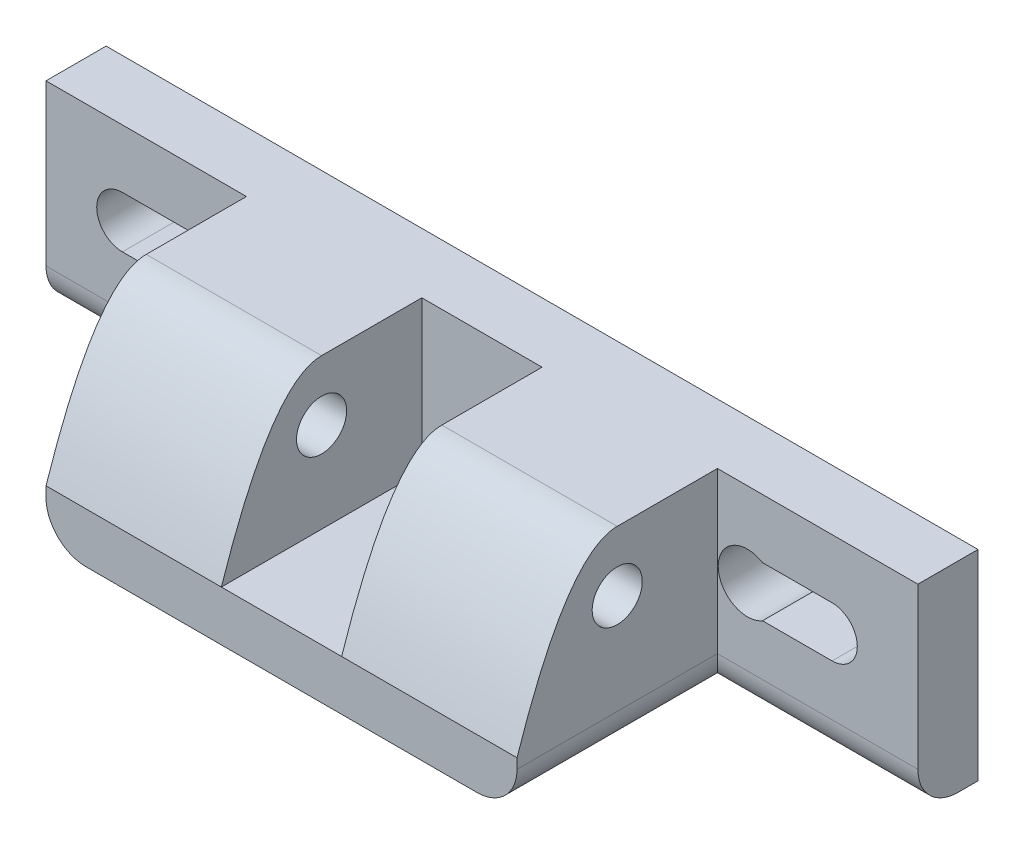
ISO-10303-21;
HEADER;
FILE_DESCRIPTION(('STEP AP214'),'2;1');
FILE_NAME('part.step','',(''),(''),'','','');
FILE_SCHEMA(('AUTOMOTIVE_DESIGN { 1 0 10303 214 1 1 1 1 }'));
ENDSEC;
DATA;
#1=APPLICATION_CONTEXT('core data for automotive mechanical design processes');
#2=APPLICATION_PROTOCOL_DEFINITION('international standard','automotive_design',2000,#1);
#3=PRODUCT_CONTEXT('',#1,'mechanical');
#4=PRODUCT('Part','Part','',(#3));
#5=PRODUCT_RELATED_PRODUCT_CATEGORY('part','',(#4));
#6=PRODUCT_DEFINITION_FORMATION('','',#4);
#7=PRODUCT_DEFINITION_CONTEXT('part definition',#1,'design');
#8=PRODUCT_DEFINITION('design','',#6,#7);
#9=PRODUCT_DEFINITION_SHAPE('','',#8);
#10=(LENGTH_UNIT() NAMED_UNIT(*) SI_UNIT(.MILLI.,.METRE.));
#11=(NAMED_UNIT(*) PLANE_ANGLE_UNIT() SI_UNIT($,.RADIAN.));
#12=(NAMED_UNIT(*) SI_UNIT($,.STERADIAN.) SOLID_ANGLE_UNIT());
#13=UNCERTAINTY_MEASURE_WITH_UNIT(LENGTH_MEASURE(1.E-05),#10,'distance_accuracy_value','');
#14=(GEOMETRIC_REPRESENTATION_CONTEXT(3) GLOBAL_UNCERTAINTY_ASSIGNED_CONTEXT((#13)) GLOBAL_UNIT_ASSIGNED_CONTEXT((#10,
#11,#12)) REPRESENTATION_CONTEXT('',''));
#15=CARTESIAN_POINT('',(0.,0.,0.));
#16=DIRECTION('',(0.,0.,1.));
#17=DIRECTION('',(1.,0.,0.));
#18=AXIS2_PLACEMENT_3D('',#15,#16,#17);
#19=CARTESIAN_POINT('',(0.,25.4,0.));
#20=DIRECTION('',(0.,1.,0.));
#21=DIRECTION('',(0.,0.,1.));
#22=AXIS2_PLACEMENT_3D('',#19,#20,#21);
#23=PLANE('',#22);
#24=DIRECTION('',(0.,0.,1.));
#25=VECTOR('',#24,1.);
#26=CARTESIAN_POINT('',(-29.845,25.4,12.7));
#27=LINE('',#26,#25);
#28=CARTESIAN_POINT('',(-29.845,25.4,-12.7));
#29=VERTEX_POINT('',#28);
#30=CARTESIAN_POINT('',(-29.845,25.4,0.));
#31=VERTEX_POINT('',#30);
#32=EDGE_CURVE('E399',#29,#31,#27,.T.);
#33=ORIENTED_EDGE('',*,*,#32,.T.);
#34=DIRECTION('',(1.,0.,0.));
#35=VECTOR('',#34,1.);
#36=CARTESIAN_POINT('',(-55.245025,25.4,0.));
#37=LINE('',#36,#35);
#38=CARTESIAN_POINT('',(-7.62,25.4,0.));
#39=VERTEX_POINT('',#38);
#40=EDGE_CURVE('E762',#31,#39,#37,.T.);
#41=ORIENTED_EDGE('',*,*,#40,.T.);
#42=DIRECTION('',(0.,0.,1.));
#43=VECTOR('',#42,1.);
#44=CARTESIAN_POINT('',(-7.62,25.4,12.7));
#45=LINE('',#44,#43);
#46=CARTESIAN_POINT('',(-7.61999999999999,25.4,-12.7));
#47=VERTEX_POINT('',#46);
#48=EDGE_CURVE('E417',#47,#39,#45,.T.);
#49=ORIENTED_EDGE('',*,*,#48,.F.);
#50=DIRECTION('',(1.,0.,0.));
#51=VECTOR('',#50,1.);
#52=CARTESIAN_POINT('',(55.245,25.4,-12.7));
#53=LINE('',#52,#51);
#54=CARTESIAN_POINT('',(7.62,25.4,-12.7));
#55=VERTEX_POINT('',#54);
#56=EDGE_CURVE('E451',#47,#55,#53,.T.);
#57=ORIENTED_EDGE('',*,*,#56,.T.);
#58=DIRECTION('',(0.,0.,-1.));
#59=VECTOR('',#58,1.);
#60=CARTESIAN_POINT('',(7.62,25.4,12.7));
#61=LINE('',#60,#59);
#62=CARTESIAN_POINT('',(7.62,25.4,0.));
#63=VERTEX_POINT('',#62);
#64=EDGE_CURVE('E420',#63,#55,#61,.T.);
#65=ORIENTED_EDGE('',*,*,#64,.F.);
#66=CARTESIAN_POINT('',(29.845,25.4,0.));
#67=VERTEX_POINT('',#66);
#68=EDGE_CURVE('E763',#63,#67,#37,.T.);
#69=ORIENTED_EDGE('',*,*,#68,.T.);
#70=DIRECTION('',(0.,0.,-1.));
#71=VECTOR('',#70,1.);
#72=CARTESIAN_POINT('',(29.845,25.4,12.7));
#73=LINE('',#72,#71);
#74=CARTESIAN_POINT('',(29.845,25.4,-12.7));
#75=VERTEX_POINT('',#74);
#76=EDGE_CURVE('E410',#67,#75,#73,.T.);
#77=ORIENTED_EDGE('',*,*,#76,.T.);
#78=CARTESIAN_POINT('',(55.245,25.4,-12.7));
#79=VERTEX_POINT('',#78);
#80=EDGE_CURVE('E448',#75,#79,#53,.T.);
#81=ORIENTED_EDGE('',*,*,#80,.T.);
#82=DIRECTION('',(0.,0.,1.));
#83=VECTOR('',#82,1.);
#84=CARTESIAN_POINT('',(55.245,25.4,-20.32));
#85=LINE('',#84,#83);
#86=CARTESIAN_POINT('',(55.245,25.4,-20.32));
#87=VERTEX_POINT('',#86);
#88=EDGE_CURVE('E458',#87,#79,#85,.T.);
#89=ORIENTED_EDGE('',*,*,#88,.F.);
#90=DIRECTION('',(1.,0.,0.));
#91=VECTOR('',#90,1.);
#92=CARTESIAN_POINT('',(55.245,25.4,-20.32));
#93=LINE('',#92,#91);
#94=CARTESIAN_POINT('',(-55.245,25.4,-20.32));
#95=VERTEX_POINT('',#94);
#96=EDGE_CURVE('E476',#95,#87,#93,.T.);
#97=ORIENTED_EDGE('',*,*,#96,.F.);
#98=DIRECTION('',(0.,0.,1.));
#99=VECTOR('',#98,1.);
#100=CARTESIAN_POINT('',(-55.245,25.4,-20.32));
#101=LINE('',#100,#99);
#102=CARTESIAN_POINT('',(-55.245,25.4,-12.7));
#103=VERTEX_POINT('',#102);
#104=EDGE_CURVE('E470',#95,#103,#101,.T.);
#105=ORIENTED_EDGE('',*,*,#104,.T.);
#106=EDGE_CURVE('E462',#103,#29,#53,.T.);
#107=ORIENTED_EDGE('',*,*,#106,.T.);
#108=EDGE_LOOP('',(#33,#41,#49,#57,#65,#69,#77,#81,#89,#97,#105,#107));
#109=FACE_BOUND('',#108,.T.);
#110=ADVANCED_FACE('F35',(#109),#23,.T.);
#111=CARTESIAN_POINT('',(-29.845,25.4,12.7));
#112=DIRECTION('',(1.,0.,0.));
#113=DIRECTION('',(0.,0.,-1.));
#114=AXIS2_PLACEMENT_3D('',#111,#112,#113);
#115=PLANE('',#114);
#116=CARTESIAN_POINT('',(-29.845,17.78,0.));
#117=DIRECTION('',(-1.,0.,0.));
#118=DIRECTION('',(0.,0.,1.));
#119=AXIS2_PLACEMENT_3D('',#116,#117,#118);
#120=CIRCLE('',#119,3.175);
#121=CARTESIAN_POINT('',(-29.845,17.78,3.175));
#122=VERTEX_POINT('',#121);
#123=EDGE_CURVE('E441',#122,#122,#120,.T.);
#124=ORIENTED_EDGE('',*,*,#123,.F.);
#125=EDGE_LOOP('',(#124));
#126=FACE_BOUND('',#125,.T.);
#127=DIRECTION('',(0.,-1.,0.));
#128=VECTOR('',#127,1.);
#129=CARTESIAN_POINT('',(-29.845,25.4,-12.7));
#130=LINE('',#129,#128);
#131=CARTESIAN_POINT('',(-29.845,5.08,-12.7));
#132=VERTEX_POINT('',#131);
#133=EDGE_CURVE('E405',#29,#132,#130,.T.);
#134=ORIENTED_EDGE('',*,*,#133,.T.);
#135=DIRECTION('',(0.,0.,1.));
#136=VECTOR('',#135,1.);
#137=CARTESIAN_POINT('',(-29.845,5.08,12.7));
#138=LINE('',#137,#136);
#139=CARTESIAN_POINT('',(-29.845,5.08,12.7));
#140=VERTEX_POINT('',#139);
#141=EDGE_CURVE('E367',#132,#140,#138,.T.);
#142=ORIENTED_EDGE('',*,*,#141,.T.);
#143=DIRECTION('',(0.,-1.,0.));
#144=VECTOR('',#143,1.);
#145=CARTESIAN_POINT('',(-29.845,25.4,12.7));
#146=LINE('',#145,#144);
#147=CARTESIAN_POINT('',(-29.845,6.35,12.7));
#148=VERTEX_POINT('',#147);
#149=EDGE_CURVE('E538',#148,#140,#146,.T.);
#150=ORIENTED_EDGE('',*,*,#149,.F.);
#151=CARTESIAN_POINT('',(-29.845,6.35,12.7));
#152=CARTESIAN_POINT('',(-29.845,25.4,6.35));
#153=CARTESIAN_POINT('',(-29.845,25.4,0.));
#154=B_SPLINE_CURVE_WITH_KNOTS('',2,(#151,#152,#153),.UNSPECIFIED.,.F.,.F.,(3,3),(0.,0.5),.UNSPECIFIED.);
#155=EDGE_CURVE('E489',#148,#31,#154,.T.);
#156=ORIENTED_EDGE('',*,*,#155,.T.);
#157=ORIENTED_EDGE('',*,*,#32,.F.);
#158=EDGE_LOOP('',(#134,#142,#150,#156,#157));
#159=FACE_BOUND('',#158,.T.);
#160=ADVANCED_FACE('F323',(#126,#159),#115,.F.);
#161=CARTESIAN_POINT('',(29.845,25.4,12.7));
#162=DIRECTION('',(0.,0.,-1.));
#163=DIRECTION('',(-1.,0.,0.));
#164=AXIS2_PLACEMENT_3D('',#161,#162,#163);
#165=PLANE('',#164);
#166=ORIENTED_EDGE('',*,*,#149,.T.);
#167=CARTESIAN_POINT('',(-24.765,5.08,12.7));
#168=DIRECTION('',(0.,0.,-1.));
#169=DIRECTION('',(-1.,0.,0.));
#170=AXIS2_PLACEMENT_3D('',#167,#168,#169);
#171=CIRCLE('',#170,5.08);
#172=CARTESIAN_POINT('',(-24.765,0.,12.7));
#173=VERTEX_POINT('',#172);
#174=EDGE_CURVE('E366',#140,#173,#171,.F.);
#175=ORIENTED_EDGE('',*,*,#174,.T.);
#176=DIRECTION('',(1.,0.,0.));
#177=VECTOR('',#176,1.);
#178=CARTESIAN_POINT('',(29.845,0.,12.7));
#179=LINE('',#178,#177);
#180=CARTESIAN_POINT('',(24.765,0.,12.7));
#181=VERTEX_POINT('',#180);
#182=EDGE_CURVE('E390',#173,#181,#179,.T.);
#183=ORIENTED_EDGE('',*,*,#182,.T.);
#184=CARTESIAN_POINT('',(24.765,5.08,12.7));
#185=DIRECTION('',(0.,0.,-1.));
#186=DIRECTION('',(-1.,0.,0.));
#187=AXIS2_PLACEMENT_3D('',#184,#185,#186);
#188=CIRCLE('',#187,5.08);
#189=CARTESIAN_POINT('',(29.845,5.08,12.7));
#190=VERTEX_POINT('',#189);
#191=EDGE_CURVE('E358',#181,#190,#188,.F.);
#192=ORIENTED_EDGE('',*,*,#191,.T.);
#193=DIRECTION('',(0.,-1.,0.));
#194=VECTOR('',#193,1.);
#195=CARTESIAN_POINT('',(29.845,25.4,12.7));
#196=LINE('',#195,#194);
#197=CARTESIAN_POINT('',(29.845,6.35,12.7));
#198=VERTEX_POINT('',#197);
#199=EDGE_CURVE('E542',#198,#190,#196,.T.);
#200=ORIENTED_EDGE('',*,*,#199,.F.);
#201=DIRECTION('',(1.,0.,0.));
#202=VECTOR('',#201,1.);
#203=CARTESIAN_POINT('',(-55.245025,6.35,12.7));
#204=LINE('',#203,#202);
#205=CARTESIAN_POINT('',(7.62,6.35,12.7));
#206=VERTEX_POINT('',#205);
#207=EDGE_CURVE('E760',#206,#198,#204,.T.);
#208=ORIENTED_EDGE('',*,*,#207,.F.);
#209=DIRECTION('',(1.,0.,0.));
#210=VECTOR('',#209,1.);
#211=CARTESIAN_POINT('',(7.62,6.35,12.7));
#212=LINE('',#211,#210);
#213=CARTESIAN_POINT('',(-7.62,6.35,12.7));
#214=VERTEX_POINT('',#213);
#215=EDGE_CURVE('E431',#214,#206,#212,.T.);
#216=ORIENTED_EDGE('',*,*,#215,.F.);
#217=EDGE_CURVE('E540',#148,#214,#204,.T.);
#218=ORIENTED_EDGE('',*,*,#217,.F.);
#219=EDGE_LOOP('',(#166,#175,#183,#192,#200,#208,#216,#218));
#220=FACE_BOUND('',#219,.T.);
#221=ADVANCED_FACE('F331',(#220),#165,.F.);
#222=CARTESIAN_POINT('',(29.845,25.4,12.7));
#223=DIRECTION('',(-1.,0.,0.));
#224=DIRECTION('',(0.,0.,1.));
#225=AXIS2_PLACEMENT_3D('',#222,#223,#224);
#226=PLANE('',#225);
#227=CARTESIAN_POINT('',(29.845,17.78,0.));
#228=DIRECTION('',(-1.,0.,0.));
#229=DIRECTION('',(0.,0.,1.));
#230=AXIS2_PLACEMENT_3D('',#227,#228,#229);
#231=CIRCLE('',#230,3.175);
#232=CARTESIAN_POINT('',(29.845,17.78,3.175));
#233=VERTEX_POINT('',#232);
#234=EDGE_CURVE('E444',#233,#233,#231,.T.);
#235=ORIENTED_EDGE('',*,*,#234,.T.);
#236=EDGE_LOOP('',(#235));
#237=FACE_BOUND('',#236,.T.);
#238=ORIENTED_EDGE('',*,*,#199,.T.);
#239=DIRECTION('',(0.,0.,-1.));
#240=VECTOR('',#239,1.);
#241=CARTESIAN_POINT('',(29.845,5.08,12.7));
#242=LINE('',#241,#240);
#243=CARTESIAN_POINT('',(29.845,5.08,-12.7));
#244=VERTEX_POINT('',#243);
#245=EDGE_CURVE('E362',#190,#244,#242,.T.);
#246=ORIENTED_EDGE('',*,*,#245,.T.);
#247=DIRECTION('',(0.,-1.,0.));
#248=VECTOR('',#247,1.);
#249=CARTESIAN_POINT('',(29.845,25.4,-12.7));
#250=LINE('',#249,#248);
#251=EDGE_CURVE('E409',#75,#244,#250,.T.);
#252=ORIENTED_EDGE('',*,*,#251,.F.);
#253=ORIENTED_EDGE('',*,*,#76,.F.);
#254=CARTESIAN_POINT('',(29.845,6.35,12.7));
#255=CARTESIAN_POINT('',(29.845,25.4,6.35));
#256=CARTESIAN_POINT('',(29.845,25.4,0.));
#257=B_SPLINE_CURVE_WITH_KNOTS('',2,(#254,#255,#256),.UNSPECIFIED.,.F.,.F.,(3,3),(0.,0.5),.UNSPECIFIED.);
#258=EDGE_CURVE('E267',#198,#67,#257,.T.);
#259=ORIENTED_EDGE('',*,*,#258,.F.);
#260=EDGE_LOOP('',(#238,#246,#252,#253,#259));
#261=FACE_BOUND('',#260,.T.);
#262=ADVANCED_FACE('F327',(#237,#261),#226,.F.);
#263=CARTESIAN_POINT('',(0.,0.,0.));
#264=DIRECTION('',(0.,1.,0.));
#265=DIRECTION('',(0.,0.,1.));
#266=AXIS2_PLACEMENT_3D('',#263,#264,#265);
#267=PLANE('',#266);
#268=DIRECTION('',(0.,0.,1.));
#269=VECTOR('',#268,1.);
#270=CARTESIAN_POINT('',(-24.765,0.,0.));
#271=LINE('',#270,#269);
#272=CARTESIAN_POINT('',(-24.765,0.,-17.78));
#273=VERTEX_POINT('',#272);
#274=EDGE_CURVE('E520',#173,#273,#271,.F.);
#275=ORIENTED_EDGE('',*,*,#274,.T.);
#276=DIRECTION('',(-1.,0.,0.));
#277=VECTOR('',#276,1.);
#278=CARTESIAN_POINT('',(0.,0.,-17.78));
#279=LINE('',#278,#277);
#280=CARTESIAN_POINT('',(-55.245,0.,-17.78));
#281=VERTEX_POINT('',#280);
#282=EDGE_CURVE('E514',#273,#281,#279,.T.);
#283=ORIENTED_EDGE('',*,*,#282,.T.);
#284=DIRECTION('',(0.,0.,1.));
#285=VECTOR('',#284,1.);
#286=CARTESIAN_POINT('',(-55.245,0.,-20.32));
#287=LINE('',#286,#285);
#288=CARTESIAN_POINT('',(-55.245,0.,-20.32));
#289=VERTEX_POINT('',#288);
#290=EDGE_CURVE('E468',#289,#281,#287,.T.);
#291=ORIENTED_EDGE('',*,*,#290,.F.);
#292=DIRECTION('',(-1.,0.,0.));
#293=VECTOR('',#292,1.);
#294=CARTESIAN_POINT('',(55.245,0.,-20.32));
#295=LINE('',#294,#293);
#296=CARTESIAN_POINT('',(55.245,0.,-20.32));
#297=VERTEX_POINT('',#296);
#298=EDGE_CURVE('E485',#297,#289,#295,.T.);
#299=ORIENTED_EDGE('',*,*,#298,.F.);
#300=DIRECTION('',(0.,0.,1.));
#301=VECTOR('',#300,1.);
#302=CARTESIAN_POINT('',(55.245,0.,-20.32));
#303=LINE('',#302,#301);
#304=CARTESIAN_POINT('',(55.245,0.,-17.78));
#305=VERTEX_POINT('',#304);
#306=EDGE_CURVE('E445',#297,#305,#303,.T.);
#307=ORIENTED_EDGE('',*,*,#306,.T.);
#308=DIRECTION('',(-1.,0.,0.));
#309=VECTOR('',#308,1.);
#310=CARTESIAN_POINT('',(0.,0.,-17.78));
#311=LINE('',#310,#309);
#312=CARTESIAN_POINT('',(24.765,0.,-17.78));
#313=VERTEX_POINT('',#312);
#314=EDGE_CURVE('E518',#305,#313,#311,.T.);
#315=ORIENTED_EDGE('',*,*,#314,.T.);
#316=DIRECTION('',(0.,0.,-1.));
#317=VECTOR('',#316,1.);
#318=CARTESIAN_POINT('',(24.765,0.,0.));
#319=LINE('',#318,#317);
#320=EDGE_CURVE('E360',#313,#181,#319,.F.);
#321=ORIENTED_EDGE('',*,*,#320,.T.);
#322=ORIENTED_EDGE('',*,*,#182,.F.);
#323=EDGE_LOOP('',(#275,#283,#291,#299,#307,#315,#321,#322));
#324=FACE_BOUND('',#323,.T.);
#325=ADVANCED_FACE('F319',(#324),#267,.F.);
#326=CARTESIAN_POINT('',(-7.62,6.35,12.7));
#327=DIRECTION('',(-1.,0.,0.));
#328=DIRECTION('',(0.,0.,1.));
#329=AXIS2_PLACEMENT_3D('',#326,#327,#328);
#330=PLANE('',#329);
#331=CARTESIAN_POINT('',(-7.62,17.78,0.));
#332=DIRECTION('',(-1.,0.,0.));
#333=DIRECTION('',(0.,0.,1.));
#334=AXIS2_PLACEMENT_3D('',#331,#332,#333);
#335=CIRCLE('',#334,3.175);
#336=CARTESIAN_POINT('',(-7.61999999999999,17.78,3.175));
#337=VERTEX_POINT('',#336);
#338=EDGE_CURVE('E421',#337,#337,#335,.T.);
#339=ORIENTED_EDGE('',*,*,#338,.T.);
#340=EDGE_LOOP('',(#339));
#341=FACE_BOUND('',#340,.T.);
#342=DIRECTION('',(0.,0.,1.));
#343=VECTOR('',#342,1.);
#344=CARTESIAN_POINT('',(-7.62,6.35,12.7));
#345=LINE('',#344,#343);
#346=CARTESIAN_POINT('',(-7.62,6.35,-10.16));
#347=VERTEX_POINT('',#346);
#348=EDGE_CURVE('E435',#347,#214,#345,.T.);
#349=ORIENTED_EDGE('',*,*,#348,.F.);
#350=CARTESIAN_POINT('',(-7.62,8.89,-10.16));
#351=DIRECTION('',(-1.,0.,0.));
#352=DIRECTION('',(0.,0.,1.));
#353=AXIS2_PLACEMENT_3D('',#350,#351,#352);
#354=CIRCLE('',#353,2.54);
#355=CARTESIAN_POINT('',(-7.62,8.89,-12.7));
#356=VERTEX_POINT('',#355);
#357=EDGE_CURVE('E57',#347,#356,#354,.F.);
#358=ORIENTED_EDGE('',*,*,#357,.T.);
#359=DIRECTION('',(0.,1.,0.));
#360=VECTOR('',#359,1.);
#361=CARTESIAN_POINT('',(-7.62,6.35,-12.7));
#362=LINE('',#361,#360);
#363=EDGE_CURVE('E387',#356,#47,#362,.T.);
#364=ORIENTED_EDGE('',*,*,#363,.T.);
#365=ORIENTED_EDGE('',*,*,#48,.T.);
#366=CARTESIAN_POINT('',(-7.62,6.35,12.7));
#367=CARTESIAN_POINT('',(-7.62,25.4,6.35));
#368=CARTESIAN_POINT('',(-7.62,25.4,0.));
#369=B_SPLINE_CURVE_WITH_KNOTS('',2,(#366,#367,#368),.UNSPECIFIED.,.F.,.F.,(3,3),(0.,0.5),.UNSPECIFIED.);
#370=EDGE_CURVE('E492',#39,#214,#369,.F.);
#371=ORIENTED_EDGE('',*,*,#370,.T.);
#372=EDGE_LOOP('',(#349,#358,#364,#365,#371));
#373=FACE_BOUND('',#372,.T.);
#374=ADVANCED_FACE('F315',(#341,#373),#330,.F.);
#375=CARTESIAN_POINT('',(7.62,6.35,12.7));
#376=DIRECTION('',(1.,0.,0.));
#377=DIRECTION('',(0.,0.,-1.));
#378=AXIS2_PLACEMENT_3D('',#375,#376,#377);
#379=PLANE('',#378);
#380=CARTESIAN_POINT('',(7.62,17.78,0.));
#381=DIRECTION('',(1.,0.,0.));
#382=DIRECTION('',(0.,0.,-1.));
#383=AXIS2_PLACEMENT_3D('',#380,#381,#382);
#384=CIRCLE('',#383,3.175);
#385=CARTESIAN_POINT('',(7.62,17.78,3.175));
#386=VERTEX_POINT('',#385);
#387=EDGE_CURVE('E411',#386,#386,#384,.T.);
#388=ORIENTED_EDGE('',*,*,#387,.T.);
#389=EDGE_LOOP('',(#388));
#390=FACE_BOUND('',#389,.T.);
#391=DIRECTION('',(0.,1.,0.));
#392=VECTOR('',#391,1.);
#393=CARTESIAN_POINT('',(7.62,6.35,-12.7));
#394=LINE('',#393,#392);
#395=CARTESIAN_POINT('',(7.62,8.89,-12.7));
#396=VERTEX_POINT('',#395);
#397=EDGE_CURVE('E391',#396,#55,#394,.T.);
#398=ORIENTED_EDGE('',*,*,#397,.F.);
#399=CARTESIAN_POINT('',(7.62,8.89,-10.16));
#400=DIRECTION('',(1.,0.,0.));
#401=DIRECTION('',(0.,0.,-1.));
#402=AXIS2_PLACEMENT_3D('',#399,#400,#401);
#403=CIRCLE('',#402,2.54);
#404=CARTESIAN_POINT('',(7.62,6.35,-10.16));
#405=VERTEX_POINT('',#404);
#406=EDGE_CURVE('E11',#396,#405,#403,.F.);
#407=ORIENTED_EDGE('',*,*,#406,.T.);
#408=DIRECTION('',(0.,0.,-1.));
#409=VECTOR('',#408,1.);
#410=CARTESIAN_POINT('',(7.62,6.35,12.7));
#411=LINE('',#410,#409);
#412=EDGE_CURVE('E396',#206,#405,#411,.T.);
#413=ORIENTED_EDGE('',*,*,#412,.F.);
#414=CARTESIAN_POINT('',(7.62,6.35,12.7));
#415=CARTESIAN_POINT('',(7.62,25.4,6.35));
#416=CARTESIAN_POINT('',(7.62,25.4,0.));
#417=B_SPLINE_CURVE_WITH_KNOTS('',2,(#414,#415,#416),.UNSPECIFIED.,.F.,.F.,(3,3),(0.,0.5),.UNSPECIFIED.);
#418=EDGE_CURVE('E498',#206,#63,#417,.T.);
#419=ORIENTED_EDGE('',*,*,#418,.T.);
#420=ORIENTED_EDGE('',*,*,#64,.T.);
#421=EDGE_LOOP('',(#398,#407,#413,#419,#420));
#422=FACE_BOUND('',#421,.T.);
#423=ADVANCED_FACE('F311',(#390,#422),#379,.F.);
#424=CARTESIAN_POINT('',(0.,6.35,0.));
#425=DIRECTION('',(0.,1.,0.));
#426=DIRECTION('',(0.,0.,1.));
#427=AXIS2_PLACEMENT_3D('',#424,#425,#426);
#428=PLANE('',#427);
#429=ORIENTED_EDGE('',*,*,#412,.T.);
#430=DIRECTION('',(-1.,0.,0.));
#431=VECTOR('',#430,1.);
#432=CARTESIAN_POINT('',(0.,6.35,-10.16));
#433=LINE('',#432,#431);
#434=EDGE_CURVE('E379',#405,#347,#433,.T.);
#435=ORIENTED_EDGE('',*,*,#434,.T.);
#436=ORIENTED_EDGE('',*,*,#348,.T.);
#437=ORIENTED_EDGE('',*,*,#215,.T.);
#438=EDGE_LOOP('',(#429,#435,#436,#437));
#439=FACE_BOUND('',#438,.T.);
#440=ADVANCED_FACE('F308',(#439),#428,.T.);
#441=CARTESIAN_POINT('',(29.845,17.78,0.));
#442=DIRECTION('',(-1.,0.,0.));
#443=DIRECTION('',(0.,0.,1.));
#444=AXIS2_PLACEMENT_3D('',#441,#442,#443);
#445=CYLINDRICAL_SURFACE('',#444,3.175);
#446=CARTESIAN_POINT('',(29.845,17.78,3.175));
#447=CARTESIAN_POINT('',(29.6134895833333,17.78,3.175));
#448=CARTESIAN_POINT('',(29.3819791666667,17.78,3.175));
#449=CARTESIAN_POINT('',(28.9189583333333,17.78,3.175));
#450=CARTESIAN_POINT('',(28.6874479166667,17.78,3.175));
#451=CARTESIAN_POINT('',(28.2244270833333,17.78,3.175));
#452=CARTESIAN_POINT('',(27.9929166666667,17.78,3.175));
#453=CARTESIAN_POINT('',(27.5298958333333,17.78,3.175));
#454=CARTESIAN_POINT('',(27.2983854166667,17.78,3.175));
#455=CARTESIAN_POINT('',(26.8353645833333,17.78,3.175));
#456=CARTESIAN_POINT('',(26.6038541666667,17.78,3.175));
#457=CARTESIAN_POINT('',(26.1408333333333,17.78,3.175));
#458=CARTESIAN_POINT('',(25.9093229166667,17.78,3.175));
#459=CARTESIAN_POINT('',(25.4463020833333,17.78,3.175));
#460=CARTESIAN_POINT('',(25.2147916666667,17.78,3.175));
#461=CARTESIAN_POINT('',(24.7517708333333,17.78,3.175));
#462=CARTESIAN_POINT('',(24.5202604166667,17.78,3.175));
#463=CARTESIAN_POINT('',(24.0572395833333,17.78,3.175));
#464=CARTESIAN_POINT('',(23.8257291666667,17.78,3.175));
#465=CARTESIAN_POINT('',(23.3627083333333,17.78,3.175));
#466=CARTESIAN_POINT('',(23.1311979166667,17.78,3.175));
#467=CARTESIAN_POINT('',(22.6681770833333,17.78,3.175));
#468=CARTESIAN_POINT('',(22.4366666666667,17.78,3.175));
#469=CARTESIAN_POINT('',(21.9736458333333,17.78,3.175));
#470=CARTESIAN_POINT('',(21.7421354166667,17.78,3.175));
#471=CARTESIAN_POINT('',(21.2791145833333,17.78,3.175));
#472=CARTESIAN_POINT('',(21.0476041666667,17.78,3.175));
#473=CARTESIAN_POINT('',(20.5845833333333,17.78,3.175));
#474=CARTESIAN_POINT('',(20.3530729166667,17.78,3.175));
#475=CARTESIAN_POINT('',(19.8900520833333,17.78,3.175));
#476=CARTESIAN_POINT('',(19.6585416666667,17.78,3.175));
#477=CARTESIAN_POINT('',(19.1955208333333,17.78,3.175));
#478=CARTESIAN_POINT('',(18.9640104166667,17.78,3.175));
#479=CARTESIAN_POINT('',(18.5009895833333,17.78,3.175));
#480=CARTESIAN_POINT('',(18.2694791666667,17.78,3.175));
#481=CARTESIAN_POINT('',(17.8064583333333,17.78,3.175));
#482=CARTESIAN_POINT('',(17.5749479166667,17.78,3.175));
#483=CARTESIAN_POINT('',(17.1119270833333,17.78,3.175));
#484=CARTESIAN_POINT('',(16.8804166666667,17.78,3.175));
#485=CARTESIAN_POINT('',(16.4173958333333,17.78,3.175));
#486=CARTESIAN_POINT('',(16.1858854166667,17.78,3.175));
#487=CARTESIAN_POINT('',(15.7228645833333,17.78,3.175));
#488=CARTESIAN_POINT('',(15.4913541666667,17.78,3.175));
#489=CARTESIAN_POINT('',(15.0283333333333,17.78,3.175));
#490=CARTESIAN_POINT('',(14.7968229166667,17.78,3.175));
#491=CARTESIAN_POINT('',(14.3338020833333,17.78,3.175));
#492=CARTESIAN_POINT('',(14.1022916666667,17.78,3.175));
#493=CARTESIAN_POINT('',(13.6392708333333,17.78,3.175));
#494=CARTESIAN_POINT('',(13.4077604166667,17.78,3.175));
#495=CARTESIAN_POINT('',(12.9447395833333,17.78,3.175));
#496=CARTESIAN_POINT('',(12.7132291666667,17.78,3.175));
#497=CARTESIAN_POINT('',(12.2502083333333,17.78,3.175));
#498=CARTESIAN_POINT('',(12.0186979166667,17.78,3.175));
#499=CARTESIAN_POINT('',(11.5556770833333,17.78,3.175));
#500=CARTESIAN_POINT('',(11.3241666666667,17.78,3.175));
#501=CARTESIAN_POINT('',(10.8611458333333,17.78,3.175));
#502=CARTESIAN_POINT('',(10.6296354166667,17.78,3.175));
#503=CARTESIAN_POINT('',(10.1666145833333,17.78,3.175));
#504=CARTESIAN_POINT('',(9.93510416666667,17.78,3.175));
#505=CARTESIAN_POINT('',(9.47208333333333,17.78,3.175));
#506=CARTESIAN_POINT('',(9.24057291666666,17.78,3.175));
#507=CARTESIAN_POINT('',(8.77755208333333,17.78,3.175));
#508=CARTESIAN_POINT('',(8.54604166666667,17.78,3.175));
#509=CARTESIAN_POINT('',(8.08302083333333,17.78,3.175));
#510=CARTESIAN_POINT('',(7.85151041666667,17.78,3.175));
#511=CARTESIAN_POINT('',(7.62,17.78,3.175));
#512=B_SPLINE_CURVE_WITH_KNOTS('',3,(#446,#447,#448,#449,#450,#451,#452,#453,#454,#455,#456,
#457,#458,#459,#460,#461,#462,#463,#464,#465,#466,#467,#468,#469,#470,#471,#472,#473,#474,#475,
#476,#477,#478,#479,#480,#481,#482,#483,#484,#485,#486,#487,#488,#489,#490,#491,#492,#493,#494,
#495,#496,#497,#498,#499,#500,#501,#502,#503,#504,#505,#506,#507,#508,#509,#510,#511),
.UNSPECIFIED.,.F.,.F.,(4,2,2,2,2,2,2,2,2,2,2,2,2,2,2,2,2,2,2,2,2,2,2,2,2,2,2,2,2,2,2,2,4),(0.,
0.694531250000002,1.3890625,2.08359375,2.778125,3.47265625,4.1671875,4.86171875,5.55625,
6.25078125,6.9453125,7.63984375,8.334375,9.02890625,9.7234375,10.41796875,11.1125,11.80703125,
12.5015625,13.19609375,13.890625,14.58515625,15.2796875,15.97421875,16.66875,17.36328125,
18.0578125,18.75234375,19.446875,20.14140625,20.8359375,21.53046875,22.225),.UNSPECIFIED.);
#513=EDGE_CURVE('BSEAM306',#233,#386,#512,.T.);
#514=ORIENTED_EDGE('',*,*,#234,.F.);
#515=ORIENTED_EDGE('',*,*,#387,.F.);
#516=ORIENTED_EDGE('',*,*,#513,.T.);
#517=ORIENTED_EDGE('',*,*,#513,.F.);
#518=EDGE_LOOP('',(#514,#516,#515,#517));
#519=FACE_BOUND('',#518,.T.);
#520=ADVANCED_FACE('F306',(#519),#445,.F.);
#521=CARTESIAN_POINT('',(-29.845,17.78,3.175));
#522=CARTESIAN_POINT('',(-29.6134895833333,17.78,3.175));
#523=CARTESIAN_POINT('',(-29.3819791666667,17.78,3.175));
#524=CARTESIAN_POINT('',(-28.9189583333333,17.78,3.175));
#525=CARTESIAN_POINT('',(-28.6874479166667,17.78,3.175));
#526=CARTESIAN_POINT('',(-28.2244270833333,17.78,3.175));
#527=CARTESIAN_POINT('',(-27.9929166666667,17.78,3.175));
#528=CARTESIAN_POINT('',(-27.5298958333333,17.78,3.175));
#529=CARTESIAN_POINT('',(-27.2983854166667,17.78,3.175));
#530=CARTESIAN_POINT('',(-26.8353645833333,17.78,3.175));
#531=CARTESIAN_POINT('',(-26.6038541666667,17.78,3.175));
#532=CARTESIAN_POINT('',(-26.1408333333333,17.78,3.175));
#533=CARTESIAN_POINT('',(-25.9093229166667,17.78,3.175));
#534=CARTESIAN_POINT('',(-25.4463020833333,17.78,3.175));
#535=CARTESIAN_POINT('',(-25.2147916666667,17.78,3.175));
#536=CARTESIAN_POINT('',(-24.7517708333333,17.78,3.175));
#537=CARTESIAN_POINT('',(-24.5202604166667,17.78,3.175));
#538=CARTESIAN_POINT('',(-24.0572395833333,17.78,3.175));
#539=CARTESIAN_POINT('',(-23.8257291666667,17.78,3.175));
#540=CARTESIAN_POINT('',(-23.3627083333333,17.78,3.175));
#541=CARTESIAN_POINT('',(-23.1311979166667,17.78,3.175));
#542=CARTESIAN_POINT('',(-22.6681770833333,17.78,3.175));
#543=CARTESIAN_POINT('',(-22.4366666666667,17.78,3.175));
#544=CARTESIAN_POINT('',(-21.9736458333333,17.78,3.175));
#545=CARTESIAN_POINT('',(-21.7421354166667,17.78,3.175));
#546=CARTESIAN_POINT('',(-21.2791145833333,17.78,3.175));
#547=CARTESIAN_POINT('',(-21.0476041666667,17.78,3.175));
#548=CARTESIAN_POINT('',(-20.5845833333333,17.78,3.175));
#549=CARTESIAN_POINT('',(-20.3530729166667,17.78,3.175));
#550=CARTESIAN_POINT('',(-19.8900520833333,17.78,3.175));
#551=CARTESIAN_POINT('',(-19.6585416666667,17.78,3.175));
#552=CARTESIAN_POINT('',(-19.1955208333333,17.78,3.175));
#553=CARTESIAN_POINT('',(-18.9640104166667,17.78,3.175));
#554=CARTESIAN_POINT('',(-18.5009895833333,17.78,3.175));
#555=CARTESIAN_POINT('',(-18.2694791666667,17.78,3.175));
#556=CARTESIAN_POINT('',(-17.8064583333333,17.78,3.175));
#557=CARTESIAN_POINT('',(-17.5749479166667,17.78,3.175));
#558=CARTESIAN_POINT('',(-17.1119270833333,17.78,3.175));
#559=CARTESIAN_POINT('',(-16.8804166666667,17.78,3.175));
#560=CARTESIAN_POINT('',(-16.4173958333333,17.78,3.175));
#561=CARTESIAN_POINT('',(-16.1858854166667,17.78,3.175));
#562=CARTESIAN_POINT('',(-15.7228645833333,17.78,3.175));
#563=CARTESIAN_POINT('',(-15.4913541666667,17.78,3.175));
#564=CARTESIAN_POINT('',(-15.0283333333333,17.78,3.175));
#565=CARTESIAN_POINT('',(-14.7968229166667,17.78,3.175));
#566=CARTESIAN_POINT('',(-14.3338020833333,17.78,3.175));
#567=CARTESIAN_POINT('',(-14.1022916666667,17.78,3.175));
#568=CARTESIAN_POINT('',(-13.6392708333333,17.78,3.175));
#569=CARTESIAN_POINT('',(-13.4077604166667,17.78,3.175));
#570=CARTESIAN_POINT('',(-12.9447395833333,17.78,3.175));
#571=CARTESIAN_POINT('',(-12.7132291666667,17.78,3.175));
#572=CARTESIAN_POINT('',(-12.2502083333333,17.78,3.175));
#573=CARTESIAN_POINT('',(-12.0186979166667,17.78,3.175));
#574=CARTESIAN_POINT('',(-11.5556770833333,17.78,3.175));
#575=CARTESIAN_POINT('',(-11.3241666666667,17.78,3.175));
#576=CARTESIAN_POINT('',(-10.8611458333333,17.78,3.175));
#577=CARTESIAN_POINT('',(-10.6296354166667,17.78,3.175));
#578=CARTESIAN_POINT('',(-10.1666145833333,17.78,3.175));
#579=CARTESIAN_POINT('',(-9.93510416666666,17.78,3.175));
#580=CARTESIAN_POINT('',(-9.47208333333333,17.78,3.175));
#581=CARTESIAN_POINT('',(-9.24057291666666,17.78,3.175));
#582=CARTESIAN_POINT('',(-8.77755208333333,17.78,3.175));
#583=CARTESIAN_POINT('',(-8.54604166666666,17.78,3.175));
#584=CARTESIAN_POINT('',(-8.08302083333333,17.78,3.175));
#585=CARTESIAN_POINT('',(-7.85151041666666,17.78,3.175));
#586=CARTESIAN_POINT('',(-7.61999999999999,17.78,3.175));
#587=B_SPLINE_CURVE_WITH_KNOTS('',3,(#521,#522,#523,#524,#525,#526,#527,#528,#529,#530,#531,
#532,#533,#534,#535,#536,#537,#538,#539,#540,#541,#542,#543,#544,#545,#546,#547,#548,#549,#550,
#551,#552,#553,#554,#555,#556,#557,#558,#559,#560,#561,#562,#563,#564,#565,#566,#567,#568,#569,
#570,#571,#572,#573,#574,#575,#576,#577,#578,#579,#580,#581,#582,#583,#584,#585,#586),
.UNSPECIFIED.,.F.,.F.,(4,2,2,2,2,2,2,2,2,2,2,2,2,2,2,2,2,2,2,2,2,2,2,2,2,2,2,2,2,2,2,2,4),(0.,
0.694531249999998,1.3890625,2.08359375,2.778125,3.47265625,4.1671875,4.86171875,5.55625,
6.25078125,6.9453125,7.63984375,8.334375,9.02890625,9.7234375,10.41796875,11.1125,11.80703125,
12.5015625,13.19609375,13.890625,14.58515625,15.2796875,15.97421875,16.66875,17.36328125,
18.0578125,18.75234375,19.446875,20.14140625,20.8359375,21.53046875,22.225),.UNSPECIFIED.);
#588=EDGE_CURVE('BSEAM303',#122,#337,#587,.T.);
#589=ORIENTED_EDGE('',*,*,#123,.T.);
#590=ORIENTED_EDGE('',*,*,#338,.F.);
#591=ORIENTED_EDGE('',*,*,#588,.T.);
#592=ORIENTED_EDGE('',*,*,#588,.F.);
#593=EDGE_LOOP('',(#589,#591,#590,#592));
#594=FACE_BOUND('',#593,.T.);
#595=ADVANCED_FACE('F303',(#594),#445,.F.);
#596=CARTESIAN_POINT('',(0.,0.,-12.7));
#597=DIRECTION('',(0.,0.,-1.));
#598=DIRECTION('',(-1.,0.,0.));
#599=AXIS2_PLACEMENT_3D('',#596,#597,#598);
#600=PLANE('',#599);
#601=DIRECTION('',(1.,0.,0.));
#602=VECTOR('',#601,1.);
#603=CARTESIAN_POINT('',(0.,17.9215422158308,-12.7));
#604=LINE('',#603,#602);
#605=CARTESIAN_POINT('',(35.56,17.9215422158308,-12.7));
#606=VERTEX_POINT('',#605);
#607=CARTESIAN_POINT('',(44.3774307896907,17.9215422158308,-12.7));
#608=VERTEX_POINT('',#607);
#609=EDGE_CURVE('E261',#606,#608,#604,.T.);
#610=ORIENTED_EDGE('',*,*,#609,.T.);
#611=CARTESIAN_POINT('',(44.3774307896907,14.732,-12.7));
#612=DIRECTION('',(0.,0.,-1.));
#613=DIRECTION('',(-1.,0.,0.));
#614=AXIS2_PLACEMENT_3D('',#611,#612,#613);
#615=CIRCLE('',#614,3.18954221583075);
#616=CARTESIAN_POINT('',(44.3774307896907,11.5424577841692,-12.7));
#617=VERTEX_POINT('',#616);
#618=EDGE_CURVE('E264',#608,#617,#615,.T.);
#619=ORIENTED_EDGE('',*,*,#618,.T.);
#620=DIRECTION('',(-1.,0.,0.));
#621=VECTOR('',#620,1.);
#622=CARTESIAN_POINT('',(0.,11.5424577841692,-12.7));
#623=LINE('',#622,#621);
#624=CARTESIAN_POINT('',(35.56,11.5424577841692,-12.7));
#625=VERTEX_POINT('',#624);
#626=EDGE_CURVE('E249',#617,#625,#623,.T.);
#627=ORIENTED_EDGE('',*,*,#626,.T.);
#628=CARTESIAN_POINT('',(33.655,14.732,-12.7));
#629=DIRECTION('',(0.,0.,-1.));
#630=DIRECTION('',(-1.,0.,0.));
#631=AXIS2_PLACEMENT_3D('',#628,#629,#630);
#632=CIRCLE('',#631,3.7151318343454);
#633=EDGE_CURVE('E258',#625,#606,#632,.T.);
#634=ORIENTED_EDGE('',*,*,#633,.T.);
#635=EDGE_LOOP('',(#610,#619,#627,#634));
#636=FACE_BOUND('',#635,.T.);
#637=ORIENTED_EDGE('',*,*,#251,.T.);
#638=DIRECTION('',(-1.,0.,0.));
#639=VECTOR('',#638,1.);
#640=CARTESIAN_POINT('',(0.,5.08,-12.7));
#641=LINE('',#640,#639);
#642=CARTESIAN_POINT('',(55.245,5.08,-12.7));
#643=VERTEX_POINT('',#642);
#644=EDGE_CURVE('E369',#244,#643,#641,.F.);
#645=ORIENTED_EDGE('',*,*,#644,.T.);
#646=DIRECTION('',(0.,-1.,0.));
#647=VECTOR('',#646,1.);
#648=CARTESIAN_POINT('',(55.245,25.4,-12.7));
#649=LINE('',#648,#647);
#650=EDGE_CURVE('E488',#79,#643,#649,.T.);
#651=ORIENTED_EDGE('',*,*,#650,.F.);
#652=ORIENTED_EDGE('',*,*,#80,.F.);
#653=EDGE_LOOP('',(#637,#645,#651,#652));
#654=FACE_BOUND('',#653,.T.);
#655=ADVANCED_FACE('F294',(#636,#654),#600,.F.);
#656=ORIENTED_EDGE('',*,*,#363,.F.);
#657=DIRECTION('',(-1.,0.,0.));
#658=VECTOR('',#657,1.);
#659=CARTESIAN_POINT('',(0.,8.89,-12.7));
#660=LINE('',#659,#658);
#661=EDGE_CURVE('E43',#356,#396,#660,.F.);
#662=ORIENTED_EDGE('',*,*,#661,.T.);
#663=ORIENTED_EDGE('',*,*,#397,.T.);
#664=ORIENTED_EDGE('',*,*,#56,.F.);
#665=EDGE_LOOP('',(#656,#662,#663,#664));
#666=FACE_BOUND('',#665,.T.);
#667=ADVANCED_FACE('F295',(#666),#600,.F.);
#668=CARTESIAN_POINT('',(55.245,25.4,-20.32));
#669=DIRECTION('',(-1.,0.,0.));
#670=DIRECTION('',(0.,0.,1.));
#671=AXIS2_PLACEMENT_3D('',#668,#669,#670);
#672=PLANE('',#671);
#673=ORIENTED_EDGE('',*,*,#650,.T.);
#674=CARTESIAN_POINT('',(55.245,5.08,-17.78));
#675=DIRECTION('',(-1.,0.,0.));
#676=DIRECTION('',(0.,0.,1.));
#677=AXIS2_PLACEMENT_3D('',#674,#675,#676);
#678=CIRCLE('',#677,5.08);
#679=EDGE_CURVE('E376',#643,#305,#678,.F.);
#680=ORIENTED_EDGE('',*,*,#679,.T.);
#681=ORIENTED_EDGE('',*,*,#306,.F.);
#682=DIRECTION('',(0.,-1.,0.));
#683=VECTOR('',#682,1.);
#684=CARTESIAN_POINT('',(55.245,25.4,-20.32));
#685=LINE('',#684,#683);
#686=EDGE_CURVE('E465',#87,#297,#685,.T.);
#687=ORIENTED_EDGE('',*,*,#686,.F.);
#688=ORIENTED_EDGE('',*,*,#88,.T.);
#689=EDGE_LOOP('',(#673,#680,#681,#687,#688));
#690=FACE_BOUND('',#689,.T.);
#691=ADVANCED_FACE('F298',(#690),#672,.F.);
#692=CARTESIAN_POINT('',(-55.245,25.4,-20.32));
#693=DIRECTION('',(1.,0.,0.));
#694=DIRECTION('',(0.,0.,-1.));
#695=AXIS2_PLACEMENT_3D('',#692,#693,#694);
#696=PLANE('',#695);
#697=ORIENTED_EDGE('',*,*,#290,.T.);
#698=CARTESIAN_POINT('',(-55.245,5.08,-17.78));
#699=DIRECTION('',(1.,0.,0.));
#700=DIRECTION('',(0.,0.,-1.));
#701=AXIS2_PLACEMENT_3D('',#698,#699,#700);
#702=CIRCLE('',#701,5.08);
#703=CARTESIAN_POINT('',(-55.245,5.08,-12.7));
#704=VERTEX_POINT('',#703);
#705=EDGE_CURVE('E528',#281,#704,#702,.F.);
#706=ORIENTED_EDGE('',*,*,#705,.T.);
#707=DIRECTION('',(0.,1.,0.));
#708=VECTOR('',#707,1.);
#709=CARTESIAN_POINT('',(-55.245,25.4,-12.7));
#710=LINE('',#709,#708);
#711=EDGE_CURVE('E452',#704,#103,#710,.T.);
#712=ORIENTED_EDGE('',*,*,#711,.T.);
#713=ORIENTED_EDGE('',*,*,#104,.F.);
#714=DIRECTION('',(0.,1.,0.));
#715=VECTOR('',#714,1.);
#716=CARTESIAN_POINT('',(-55.245,25.4,-20.32));
#717=LINE('',#716,#715);
#718=EDGE_CURVE('E481',#289,#95,#717,.T.);
#719=ORIENTED_EDGE('',*,*,#718,.F.);
#720=EDGE_LOOP('',(#697,#706,#712,#713,#719));
#721=FACE_BOUND('',#720,.T.);
#722=ADVANCED_FACE('F290',(#721),#696,.F.);
#723=CARTESIAN_POINT('',(0.,0.,-20.32));
#724=DIRECTION('',(0.,0.,-1.));
#725=DIRECTION('',(-1.,0.,0.));
#726=AXIS2_PLACEMENT_3D('',#723,#724,#725);
#727=PLANE('',#726);
#728=CARTESIAN_POINT('',(-33.655,14.732,-20.32));
#729=DIRECTION('',(0.,0.,-1.));
#730=DIRECTION('',(-1.,0.,0.));
#731=AXIS2_PLACEMENT_3D('',#728,#729,#730);
#732=CIRCLE('',#731,3.77822549106094);
#733=CARTESIAN_POINT('',(-35.56,17.9948151742479,-20.32));
#734=VERTEX_POINT('',#733);
#735=CARTESIAN_POINT('',(-35.56,11.4691848257521,-20.32));
#736=VERTEX_POINT('',#735);
#737=EDGE_CURVE('E221',#734,#736,#732,.T.);
#738=ORIENTED_EDGE('',*,*,#737,.F.);
#739=DIRECTION('',(1.,0.,0.));
#740=VECTOR('',#739,1.);
#741=CARTESIAN_POINT('',(-35.56,17.9948151742479,-20.32));
#742=LINE('',#741,#740);
#743=CARTESIAN_POINT('',(-45.5561299249287,17.9948151742479,-20.32));
#744=VERTEX_POINT('',#743);
#745=EDGE_CURVE('E226',#744,#734,#742,.T.);
#746=ORIENTED_EDGE('',*,*,#745,.F.);
#747=CARTESIAN_POINT('',(-45.5561299249287,14.732,-20.32));
#748=DIRECTION('',(0.,0.,-1.));
#749=DIRECTION('',(-1.,0.,0.));
#750=AXIS2_PLACEMENT_3D('',#747,#748,#749);
#751=CIRCLE('',#750,3.26281517424795);
#752=CARTESIAN_POINT('',(-45.5561299249287,11.4691848257521,-20.32));
#753=VERTEX_POINT('',#752);
#754=EDGE_CURVE('E205',#753,#744,#751,.T.);
#755=ORIENTED_EDGE('',*,*,#754,.F.);
#756=DIRECTION('',(-1.,0.,0.));
#757=VECTOR('',#756,1.);
#758=CARTESIAN_POINT('',(-35.56,11.4691848257521,-20.32));
#759=LINE('',#758,#757);
#760=EDGE_CURVE('E216',#736,#753,#759,.T.);
#761=ORIENTED_EDGE('',*,*,#760,.F.);
#762=EDGE_LOOP('',(#738,#746,#755,#761));
#763=FACE_BOUND('',#762,.T.);
#764=CARTESIAN_POINT('',(44.3774307896907,14.732,-20.32));
#765=DIRECTION('',(0.,0.,-1.));
#766=DIRECTION('',(-1.,0.,0.));
#767=AXIS2_PLACEMENT_3D('',#764,#765,#766);
#768=CIRCLE('',#767,3.18954221583075);
#769=CARTESIAN_POINT('',(44.3774307896907,17.9215422158308,-20.32));
#770=VERTEX_POINT('',#769);
#771=CARTESIAN_POINT('',(44.3774307896907,11.5424577841692,-20.32));
#772=VERTEX_POINT('',#771);
#773=EDGE_CURVE('E233',#770,#772,#768,.T.);
#774=ORIENTED_EDGE('',*,*,#773,.F.);
#775=DIRECTION('',(1.,0.,0.));
#776=VECTOR('',#775,1.);
#777=CARTESIAN_POINT('',(44.3774307896907,17.9215422158308,-20.32));
#778=LINE('',#777,#776);
#779=CARTESIAN_POINT('',(35.56,17.9215422158308,-20.32));
#780=VERTEX_POINT('',#779);
#781=EDGE_CURVE('E243',#780,#770,#778,.T.);
#782=ORIENTED_EDGE('',*,*,#781,.F.);
#783=CARTESIAN_POINT('',(33.655,14.732,-20.32));
#784=DIRECTION('',(0.,0.,-1.));
#785=DIRECTION('',(-1.,0.,0.));
#786=AXIS2_PLACEMENT_3D('',#783,#784,#785);
#787=CIRCLE('',#786,3.7151318343454);
#788=CARTESIAN_POINT('',(35.56,11.5424577841692,-20.32));
#789=VERTEX_POINT('',#788);
#790=EDGE_CURVE('E240',#789,#780,#787,.T.);
#791=ORIENTED_EDGE('',*,*,#790,.F.);
#792=DIRECTION('',(-1.,0.,0.));
#793=VECTOR('',#792,1.);
#794=CARTESIAN_POINT('',(44.3774307896907,11.5424577841692,-20.32));
#795=LINE('',#794,#793);
#796=EDGE_CURVE('E237',#772,#789,#795,.T.);
#797=ORIENTED_EDGE('',*,*,#796,.F.);
#798=EDGE_LOOP('',(#774,#782,#791,#797));
#799=FACE_BOUND('',#798,.T.);
#800=ORIENTED_EDGE('',*,*,#686,.T.);
#801=ORIENTED_EDGE('',*,*,#298,.T.);
#802=ORIENTED_EDGE('',*,*,#718,.T.);
#803=ORIENTED_EDGE('',*,*,#96,.T.);
#804=EDGE_LOOP('',(#800,#801,#802,#803));
#805=FACE_BOUND('',#804,.T.);
#806=ADVANCED_FACE('F223',(#763,#799,#805),#727,.T.);
#807=DIRECTION('',(1.,0.,0.));
#808=VECTOR('',#807,1.);
#809=CARTESIAN_POINT('',(0.,17.9948151742479,-12.7));
#810=LINE('',#809,#808);
#811=CARTESIAN_POINT('',(-45.5561299249287,17.9948151742479,-12.7));
#812=VERTEX_POINT('',#811);
#813=CARTESIAN_POINT('',(-35.56,17.9948151742479,-12.7));
#814=VERTEX_POINT('',#813);
#815=EDGE_CURVE('E555',#812,#814,#810,.T.);
#816=ORIENTED_EDGE('',*,*,#815,.T.);
#817=CARTESIAN_POINT('',(-33.655,14.732,-12.7));
#818=DIRECTION('',(0.,0.,-1.));
#819=DIRECTION('',(-1.,0.,0.));
#820=AXIS2_PLACEMENT_3D('',#817,#818,#819);
#821=CIRCLE('',#820,3.77822549106094);
#822=CARTESIAN_POINT('',(-35.56,11.4691848257521,-12.7));
#823=VERTEX_POINT('',#822);
#824=EDGE_CURVE('E523',#814,#823,#821,.T.);
#825=ORIENTED_EDGE('',*,*,#824,.T.);
#826=DIRECTION('',(-1.,0.,0.));
#827=VECTOR('',#826,1.);
#828=CARTESIAN_POINT('',(0.,11.4691848257521,-12.7));
#829=LINE('',#828,#827);
#830=CARTESIAN_POINT('',(-45.5561299249287,11.4691848257521,-12.7));
#831=VERTEX_POINT('',#830);
#832=EDGE_CURVE('E541',#823,#831,#829,.T.);
#833=ORIENTED_EDGE('',*,*,#832,.T.);
#834=CARTESIAN_POINT('',(-45.5561299249287,14.732,-12.7));
#835=DIRECTION('',(0.,0.,-1.));
#836=DIRECTION('',(-1.,0.,0.));
#837=AXIS2_PLACEMENT_3D('',#834,#835,#836);
#838=CIRCLE('',#837,3.26281517424795);
#839=EDGE_CURVE('E208',#831,#812,#838,.T.);
#840=ORIENTED_EDGE('',*,*,#839,.T.);
#841=EDGE_LOOP('',(#816,#825,#833,#840));
#842=FACE_BOUND('',#841,.T.);
#843=ORIENTED_EDGE('',*,*,#711,.F.);
#844=DIRECTION('',(-1.,0.,0.));
#845=VECTOR('',#844,1.);
#846=CARTESIAN_POINT('',(0.,5.08,-12.7));
#847=LINE('',#846,#845);
#848=EDGE_CURVE('E371',#704,#132,#847,.F.);
#849=ORIENTED_EDGE('',*,*,#848,.T.);
#850=ORIENTED_EDGE('',*,*,#133,.F.);
#851=ORIENTED_EDGE('',*,*,#106,.F.);
#852=EDGE_LOOP('',(#843,#849,#850,#851));
#853=FACE_BOUND('',#852,.T.);
#854=ADVANCED_FACE('F289',(#842,#853),#600,.F.);
#855=CARTESIAN_POINT('',(-55.245025,6.35,12.7));
#856=CARTESIAN_POINT('',(-55.245025,25.4,6.35));
#857=CARTESIAN_POINT('',(-55.245025,25.4,0.));
#858=B_SPLINE_CURVE_WITH_KNOTS('',2,(#855,#856,#857),.UNSPECIFIED.,.F.,.F.,(3,3),(0.,0.5),.UNSPECIFIED.);
#859=DIRECTION('',(1.,0.,0.));
#860=VECTOR('',#859,1.);
#861=SURFACE_OF_LINEAR_EXTRUSION('',#858,#860);
#862=ORIENTED_EDGE('',*,*,#207,.T.);
#863=ORIENTED_EDGE('',*,*,#258,.T.);
#864=ORIENTED_EDGE('',*,*,#68,.F.);
#865=ORIENTED_EDGE('',*,*,#418,.F.);
#866=EDGE_LOOP('',(#862,#863,#864,#865));
#867=FACE_BOUND('',#866,.T.);
#868=ADVANCED_FACE('F284',(#867),#861,.F.);
#869=ORIENTED_EDGE('',*,*,#217,.T.);
#870=ORIENTED_EDGE('',*,*,#370,.F.);
#871=ORIENTED_EDGE('',*,*,#40,.F.);
#872=ORIENTED_EDGE('',*,*,#155,.F.);
#873=EDGE_LOOP('',(#869,#870,#871,#872));
#874=FACE_BOUND('',#873,.T.);
#875=ADVANCED_FACE('F279',(#874),#861,.F.);
#876=CARTESIAN_POINT('',(44.3774307896907,14.732,12.700025));
#877=DIRECTION('',(0.,0.,-1.));
#878=DIRECTION('',(-1.,0.,0.));
#879=AXIS2_PLACEMENT_3D('',#876,#877,#878);
#880=CYLINDRICAL_SURFACE('',#879,3.18954221583075);
#881=DIRECTION('',(0.,0.,-1.));
#882=VECTOR('',#881,1.);
#883=CARTESIAN_POINT('',(44.3774307896907,17.9215422158308,12.700025));
#884=LINE('',#883,#882);
#885=EDGE_CURVE('E247',#608,#770,#884,.T.);
#886=ORIENTED_EDGE('',*,*,#885,.T.);
#887=ORIENTED_EDGE('',*,*,#773,.T.);
#888=DIRECTION('',(0.,0.,-1.));
#889=VECTOR('',#888,1.);
#890=CARTESIAN_POINT('',(44.3774307896907,11.5424577841692,12.700025));
#891=LINE('',#890,#889);
#892=EDGE_CURVE('E246',#617,#772,#891,.T.);
#893=ORIENTED_EDGE('',*,*,#892,.F.);
#894=ORIENTED_EDGE('',*,*,#618,.F.);
#895=EDGE_LOOP('',(#886,#887,#893,#894));
#896=FACE_BOUND('',#895,.T.);
#897=ADVANCED_FACE('F283',(#896),#880,.F.);
#898=CARTESIAN_POINT('',(44.3774307896907,17.9215422158308,12.700025));
#899=DIRECTION('',(0.,1.,0.));
#900=DIRECTION('',(0.,0.,1.));
#901=AXIS2_PLACEMENT_3D('',#898,#899,#900);
#902=PLANE('',#901);
#903=DIRECTION('',(0.,0.,-1.));
#904=VECTOR('',#903,1.);
#905=CARTESIAN_POINT('',(35.56,17.9215422158308,12.700025));
#906=LINE('',#905,#904);
#907=EDGE_CURVE('E250',#606,#780,#906,.T.);
#908=ORIENTED_EDGE('',*,*,#907,.T.);
#909=ORIENTED_EDGE('',*,*,#781,.T.);
#910=ORIENTED_EDGE('',*,*,#885,.F.);
#911=ORIENTED_EDGE('',*,*,#609,.F.);
#912=EDGE_LOOP('',(#908,#909,#910,#911));
#913=FACE_BOUND('',#912,.T.);
#914=ADVANCED_FACE('F575',(#913),#902,.F.);
#915=CARTESIAN_POINT('',(33.655,14.732,12.700025));
#916=DIRECTION('',(0.,0.,-1.));
#917=DIRECTION('',(-1.,0.,0.));
#918=AXIS2_PLACEMENT_3D('',#915,#916,#917);
#919=CYLINDRICAL_SURFACE('',#918,3.7151318343454);
#920=DIRECTION('',(0.,0.,-1.));
#921=VECTOR('',#920,1.);
#922=CARTESIAN_POINT('',(35.56,11.5424577841692,12.700025));
#923=LINE('',#922,#921);
#924=EDGE_CURVE('E252',#625,#789,#923,.T.);
#925=ORIENTED_EDGE('',*,*,#924,.T.);
#926=ORIENTED_EDGE('',*,*,#790,.T.);
#927=ORIENTED_EDGE('',*,*,#907,.F.);
#928=ORIENTED_EDGE('',*,*,#633,.F.);
#929=EDGE_LOOP('',(#925,#926,#927,#928));
#930=FACE_BOUND('',#929,.T.);
#931=ADVANCED_FACE('F578',(#930),#919,.F.);
#932=CARTESIAN_POINT('',(44.3774307896907,11.5424577841692,12.700025));
#933=DIRECTION('',(0.,-1.,0.));
#934=DIRECTION('',(0.,0.,-1.));
#935=AXIS2_PLACEMENT_3D('',#932,#933,#934);
#936=PLANE('',#935);
#937=ORIENTED_EDGE('',*,*,#892,.T.);
#938=ORIENTED_EDGE('',*,*,#796,.T.);
#939=ORIENTED_EDGE('',*,*,#924,.F.);
#940=ORIENTED_EDGE('',*,*,#626,.F.);
#941=EDGE_LOOP('',(#937,#938,#939,#940));
#942=FACE_BOUND('',#941,.T.);
#943=ADVANCED_FACE('F570',(#942),#936,.F.);
#944=CARTESIAN_POINT('',(-33.655,14.732,12.700025));
#945=DIRECTION('',(0.,0.,-1.));
#946=DIRECTION('',(-1.,0.,0.));
#947=AXIS2_PLACEMENT_3D('',#944,#945,#946);
#948=CYLINDRICAL_SURFACE('',#947,3.77822549106094);
#949=DIRECTION('',(0.,0.,-1.));
#950=VECTOR('',#949,1.);
#951=CARTESIAN_POINT('',(-35.56,17.9948151742479,12.700025));
#952=LINE('',#951,#950);
#953=EDGE_CURVE('E231',#814,#734,#952,.T.);
#954=ORIENTED_EDGE('',*,*,#953,.T.);
#955=ORIENTED_EDGE('',*,*,#737,.T.);
#956=DIRECTION('',(0.,0.,-1.));
#957=VECTOR('',#956,1.);
#958=CARTESIAN_POINT('',(-35.56,11.4691848257521,12.700025));
#959=LINE('',#958,#957);
#960=EDGE_CURVE('E212',#823,#736,#959,.T.);
#961=ORIENTED_EDGE('',*,*,#960,.F.);
#962=ORIENTED_EDGE('',*,*,#824,.F.);
#963=EDGE_LOOP('',(#954,#955,#961,#962));
#964=FACE_BOUND('',#963,.T.);
#965=ADVANCED_FACE('F560',(#964),#948,.F.);
#966=CARTESIAN_POINT('',(-35.56,17.9948151742479,12.700025));
#967=DIRECTION('',(0.,1.,0.));
#968=DIRECTION('',(0.,0.,1.));
#969=AXIS2_PLACEMENT_3D('',#966,#967,#968);
#970=PLANE('',#969);
#971=DIRECTION('',(0.,0.,-1.));
#972=VECTOR('',#971,1.);
#973=CARTESIAN_POINT('',(-45.5561299249287,17.9948151742479,12.700025));
#974=LINE('',#973,#972);
#975=EDGE_CURVE('E211',#812,#744,#974,.T.);
#976=ORIENTED_EDGE('',*,*,#975,.T.);
#977=ORIENTED_EDGE('',*,*,#745,.T.);
#978=ORIENTED_EDGE('',*,*,#953,.F.);
#979=ORIENTED_EDGE('',*,*,#815,.F.);
#980=EDGE_LOOP('',(#976,#977,#978,#979));
#981=FACE_BOUND('',#980,.T.);
#982=ADVANCED_FACE('F562',(#981),#970,.F.);
#983=CARTESIAN_POINT('',(-45.5561299249287,14.732,12.700025));
#984=DIRECTION('',(0.,0.,-1.));
#985=DIRECTION('',(-1.,0.,0.));
#986=AXIS2_PLACEMENT_3D('',#983,#984,#985);
#987=CYLINDRICAL_SURFACE('',#986,3.26281517424795);
#988=DIRECTION('',(0.,0.,-1.));
#989=VECTOR('',#988,1.);
#990=CARTESIAN_POINT('',(-45.5561299249287,11.4691848257521,12.700025));
#991=LINE('',#990,#989);
#992=EDGE_CURVE('E200',#831,#753,#991,.T.);
#993=ORIENTED_EDGE('',*,*,#992,.T.);
#994=ORIENTED_EDGE('',*,*,#754,.T.);
#995=ORIENTED_EDGE('',*,*,#975,.F.);
#996=ORIENTED_EDGE('',*,*,#839,.F.);
#997=EDGE_LOOP('',(#993,#994,#995,#996));
#998=FACE_BOUND('',#997,.T.);
#999=ADVANCED_FACE('F202',(#998),#987,.F.);
#1000=CARTESIAN_POINT('',(-35.56,11.4691848257521,12.700025));
#1001=DIRECTION('',(0.,-1.,0.));
#1002=DIRECTION('',(0.,0.,-1.));
#1003=AXIS2_PLACEMENT_3D('',#1000,#1001,#1002);
#1004=PLANE('',#1003);
#1005=ORIENTED_EDGE('',*,*,#960,.T.);
#1006=ORIENTED_EDGE('',*,*,#760,.T.);
#1007=ORIENTED_EDGE('',*,*,#992,.F.);
#1008=ORIENTED_EDGE('',*,*,#832,.F.);
#1009=EDGE_LOOP('',(#1005,#1006,#1007,#1008));
#1010=FACE_BOUND('',#1009,.T.);
#1011=ADVANCED_FACE('F217',(#1010),#1004,.F.);
#1012=CARTESIAN_POINT('',(-24.765,5.08,12.7));
#1013=DIRECTION('',(0.,0.,1.));
#1014=DIRECTION('',(1.,0.,0.));
#1015=AXIS2_PLACEMENT_3D('',#1012,#1013,#1014);
#1016=CYLINDRICAL_SURFACE('',#1015,5.08);
#1017=ORIENTED_EDGE('',*,*,#174,.F.);
#1018=ORIENTED_EDGE('',*,*,#141,.F.);
#1019=CARTESIAN_POINT('',(-24.765,5.08,-17.78));
#1020=DIRECTION('',(-0.707106781186548,0.,-0.707106781186547));
#1021=DIRECTION('',(-0.707106781186547,0.,0.707106781186547));
#1022=AXIS2_PLACEMENT_3D('',#1019,#1020,#1021);
#1023=ELLIPSE('',#1022,7.18420489685532,5.08);
#1024=EDGE_CURVE('E380',#273,#132,#1023,.T.);
#1025=ORIENTED_EDGE('',*,*,#1024,.F.);
#1026=ORIENTED_EDGE('',*,*,#274,.F.);
#1027=EDGE_LOOP('',(#1017,#1018,#1025,#1026));
#1028=FACE_BOUND('',#1027,.T.);
#1029=ADVANCED_FACE('F343',(#1028),#1016,.T.);
#1030=CARTESIAN_POINT('',(0.,5.08,-17.78));
#1031=DIRECTION('',(-1.,0.,0.));
#1032=DIRECTION('',(0.,0.,1.));
#1033=AXIS2_PLACEMENT_3D('',#1030,#1031,#1032);
#1034=CYLINDRICAL_SURFACE('',#1033,5.08);
#1035=ORIENTED_EDGE('',*,*,#1024,.T.);
#1036=ORIENTED_EDGE('',*,*,#848,.F.);
#1037=ORIENTED_EDGE('',*,*,#705,.F.);
#1038=ORIENTED_EDGE('',*,*,#282,.F.);
#1039=EDGE_LOOP('',(#1035,#1036,#1037,#1038));
#1040=FACE_BOUND('',#1039,.T.);
#1041=ADVANCED_FACE('F339',(#1040),#1034,.T.);
#1042=CARTESIAN_POINT('',(24.765,5.08,12.7));
#1043=DIRECTION('',(0.,0.,-1.));
#1044=DIRECTION('',(-1.,0.,0.));
#1045=AXIS2_PLACEMENT_3D('',#1042,#1043,#1044);
#1046=CYLINDRICAL_SURFACE('',#1045,5.08);
#1047=ORIENTED_EDGE('',*,*,#191,.F.);
#1048=ORIENTED_EDGE('',*,*,#320,.F.);
#1049=CARTESIAN_POINT('',(24.765,5.08,-17.78));
#1050=DIRECTION('',(-0.707106781186547,0.,0.707106781186547));
#1051=DIRECTION('',(-0.707106781186548,0.,-0.707106781186547));
#1052=AXIS2_PLACEMENT_3D('',#1049,#1050,#1051);
#1053=ELLIPSE('',#1052,7.18420489685532,5.08);
#1054=EDGE_CURVE('E383',#244,#313,#1053,.F.);
#1055=ORIENTED_EDGE('',*,*,#1054,.F.);
#1056=ORIENTED_EDGE('',*,*,#245,.F.);
#1057=EDGE_LOOP('',(#1047,#1048,#1055,#1056));
#1058=FACE_BOUND('',#1057,.T.);
#1059=ADVANCED_FACE('F342',(#1058),#1046,.T.);
#1060=CARTESIAN_POINT('',(0.,5.08,-17.78));
#1061=DIRECTION('',(-1.,0.,0.));
#1062=DIRECTION('',(0.,0.,1.));
#1063=AXIS2_PLACEMENT_3D('',#1060,#1061,#1062);
#1064=CYLINDRICAL_SURFACE('',#1063,5.08);
#1065=ORIENTED_EDGE('',*,*,#679,.F.);
#1066=ORIENTED_EDGE('',*,*,#644,.F.);
#1067=ORIENTED_EDGE('',*,*,#1054,.T.);
#1068=ORIENTED_EDGE('',*,*,#314,.F.);
#1069=EDGE_LOOP('',(#1065,#1066,#1067,#1068));
#1070=FACE_BOUND('',#1069,.T.);
#1071=ADVANCED_FACE('F348',(#1070),#1064,.T.);
#1072=CARTESIAN_POINT('',(0.,8.89,-10.16));
#1073=DIRECTION('',(-1.,0.,0.));
#1074=DIRECTION('',(0.,0.,1.));
#1075=AXIS2_PLACEMENT_3D('',#1072,#1073,#1074);
#1076=CYLINDRICAL_SURFACE('',#1075,2.54);
#1077=ORIENTED_EDGE('',*,*,#406,.F.);
#1078=ORIENTED_EDGE('',*,*,#661,.F.);
#1079=ORIENTED_EDGE('',*,*,#357,.F.);
#1080=ORIENTED_EDGE('',*,*,#434,.F.);
#1081=EDGE_LOOP('',(#1077,#1078,#1079,#1080));
#1082=FACE_BOUND('',#1081,.T.);
#1083=ADVANCED_FACE('F37',(#1082),#1076,.F.);
#1084=CLOSED_SHELL('',(#110,#160,#221,#262,#325,#374,#423,#440,#520,#595,#655,#667,#691,#722,
#806,#854,#868,#875,#897,#914,#931,#943,#965,#982,#999,#1011,#1029,#1041,#1059,#1071,#1083));
#1085=MANIFOLD_SOLID_BREP('B2',#1084);
#1086=ADVANCED_BREP_SHAPE_REPRESENTATION('',(#18,#1085),#14);
#1087=SHAPE_DEFINITION_REPRESENTATION(#9,#1086);
ENDSEC;
END-ISO-10303-21;
